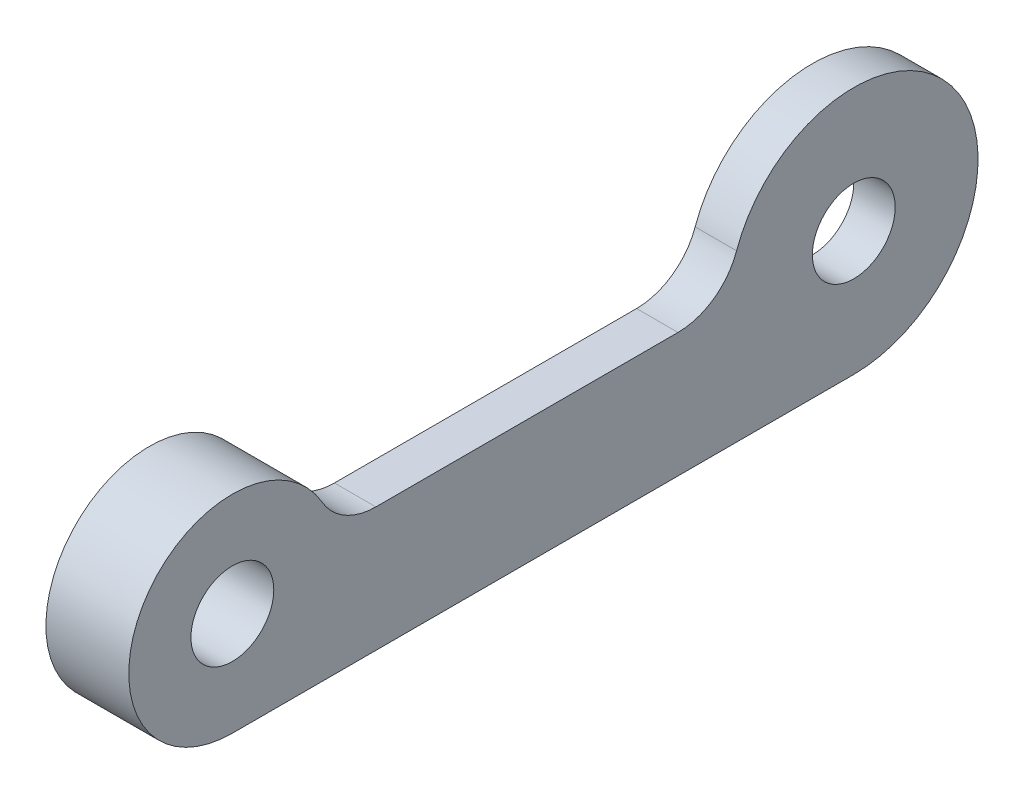
ISO-10303-21;
HEADER;
FILE_DESCRIPTION(('STEP AP214'),'2;1');
FILE_NAME('part.step','',(''),(''),'','','');
FILE_SCHEMA(('AUTOMOTIVE_DESIGN { 1 0 10303 214 1 1 1 1 }'));
ENDSEC;
DATA;
#1=APPLICATION_CONTEXT('core data for automotive mechanical design processes');
#2=APPLICATION_PROTOCOL_DEFINITION('international standard','automotive_design',2000,#1);
#3=PRODUCT_CONTEXT('',#1,'mechanical');
#4=PRODUCT('Part','Part','',(#3));
#5=PRODUCT_RELATED_PRODUCT_CATEGORY('part','',(#4));
#6=PRODUCT_DEFINITION_FORMATION('','',#4);
#7=PRODUCT_DEFINITION_CONTEXT('part definition',#1,'design');
#8=PRODUCT_DEFINITION('design','',#6,#7);
#9=PRODUCT_DEFINITION_SHAPE('','',#8);
#10=(LENGTH_UNIT() NAMED_UNIT(*) SI_UNIT(.MILLI.,.METRE.));
#11=(NAMED_UNIT(*) PLANE_ANGLE_UNIT() SI_UNIT($,.RADIAN.));
#12=(NAMED_UNIT(*) SI_UNIT($,.STERADIAN.) SOLID_ANGLE_UNIT());
#13=UNCERTAINTY_MEASURE_WITH_UNIT(LENGTH_MEASURE(1.E-05),#10,'distance_accuracy_value','');
#14=(GEOMETRIC_REPRESENTATION_CONTEXT(3) GLOBAL_UNCERTAINTY_ASSIGNED_CONTEXT((#13)) GLOBAL_UNIT_ASSIGNED_CONTEXT((#10,
#11,#12)) REPRESENTATION_CONTEXT('',''));
#15=CARTESIAN_POINT('',(0.,0.,0.));
#16=DIRECTION('',(0.,0.,1.));
#17=DIRECTION('',(1.,0.,0.));
#18=AXIS2_PLACEMENT_3D('',#15,#16,#17);
#19=CARTESIAN_POINT('',(2.,-1.,0.));
#20=DIRECTION('',(1.,0.,0.));
#21=DIRECTION('',(0.,0.,-1.));
#22=AXIS2_PLACEMENT_3D('',#19,#20,#21);
#23=PLANE('',#22);
#24=CARTESIAN_POINT('',(2.,-1.,0.));
#25=DIRECTION('',(1.,0.,0.));
#26=DIRECTION('',(0.,0.,-1.));
#27=AXIS2_PLACEMENT_3D('',#24,#25,#26);
#28=CIRCLE('',#27,2.);
#29=CARTESIAN_POINT('',(2.,-1.,-2.));
#30=VERTEX_POINT('',#29);
#31=EDGE_CURVE('E156',#30,#30,#28,.T.);
#32=ORIENTED_EDGE('',*,*,#31,.F.);
#33=EDGE_LOOP('',(#32));
#34=FACE_BOUND('',#33,.T.);
#35=CARTESIAN_POINT('',(2.,0.,-30.));
#36=DIRECTION('',(1.,0.,0.));
#37=DIRECTION('',(0.,0.,-1.));
#38=AXIS2_PLACEMENT_3D('',#35,#36,#37);
#39=CIRCLE('',#38,2.);
#40=CARTESIAN_POINT('',(2.,0.,-32.));
#41=VERTEX_POINT('',#40);
#42=EDGE_CURVE('E209',#41,#41,#39,.T.);
#43=ORIENTED_EDGE('',*,*,#42,.F.);
#44=EDGE_LOOP('',(#43));
#45=FACE_BOUND('',#44,.T.);
#46=DIRECTION('',(0.,0.,-1.));
#47=VECTOR('',#46,1.);
#48=CARTESIAN_POINT('',(2.,-6.,0.));
#49=LINE('',#48,#47);
#50=CARTESIAN_POINT('',(2.,-5.99999999999999,0.));
#51=VERTEX_POINT('',#50);
#52=CARTESIAN_POINT('',(2.,-6.,-30.));
#53=VERTEX_POINT('',#52);
#54=EDGE_CURVE('E131',#51,#53,#49,.T.);
#55=ORIENTED_EDGE('',*,*,#54,.T.);
#56=CARTESIAN_POINT('',(2.,0.,-30.));
#57=DIRECTION('',(1.,0.,0.));
#58=DIRECTION('',(0.,0.,-1.));
#59=AXIS2_PLACEMENT_3D('',#56,#57,#58);
#60=CIRCLE('',#59,6.);
#61=CARTESIAN_POINT('',(2.,2.,-24.3431457505076));
#62=VERTEX_POINT('',#61);
#63=EDGE_CURVE('E139',#53,#62,#60,.T.);
#64=ORIENTED_EDGE('',*,*,#63,.T.);
#65=CARTESIAN_POINT('',(2.,3.,-21.5147186257614));
#66=DIRECTION('',(1.,0.,0.));
#67=DIRECTION('',(0.,0.,-1.));
#68=AXIS2_PLACEMENT_3D('',#65,#66,#67);
#69=CIRCLE('',#68,3.);
#70=CARTESIAN_POINT('',(2.,0.,-21.5147186257614));
#71=VERTEX_POINT('',#70);
#72=EDGE_CURVE('E166',#62,#71,#69,.F.);
#73=ORIENTED_EDGE('',*,*,#72,.T.);
#74=DIRECTION('',(0.,0.,-1.));
#75=VECTOR('',#74,1.);
#76=CARTESIAN_POINT('',(2.,0.,0.));
#77=LINE('',#76,#75);
#78=CARTESIAN_POINT('',(2.,0.,-6.9282032302755));
#79=VERTEX_POINT('',#78);
#80=EDGE_CURVE('E146',#79,#71,#77,.T.);
#81=ORIENTED_EDGE('',*,*,#80,.F.);
#82=CARTESIAN_POINT('',(2.,3.,-6.9282032302755));
#83=DIRECTION('',(1.,0.,0.));
#84=DIRECTION('',(0.,0.,-1.));
#85=AXIS2_PLACEMENT_3D('',#82,#83,#84);
#86=CIRCLE('',#85,3.);
#87=CARTESIAN_POINT('',(2.,1.5,-4.33012701892218));
#88=VERTEX_POINT('',#87);
#89=EDGE_CURVE('E12',#79,#88,#86,.F.);
#90=ORIENTED_EDGE('',*,*,#89,.T.);
#91=CARTESIAN_POINT('',(2.,-1.,0.));
#92=DIRECTION('',(1.,0.,0.));
#93=DIRECTION('',(0.,0.,-1.));
#94=AXIS2_PLACEMENT_3D('',#91,#92,#93);
#95=CIRCLE('',#94,4.99999999999999);
#96=EDGE_CURVE('E132',#88,#51,#95,.T.);
#97=ORIENTED_EDGE('',*,*,#96,.T.);
#98=EDGE_LOOP('',(#55,#64,#73,#81,#90,#97));
#99=FACE_BOUND('',#98,.T.);
#100=ADVANCED_FACE('F65',(#34,#45,#99),#23,.T.);
#101=CARTESIAN_POINT('',(2.,-1.,0.));
#102=DIRECTION('',(-1.,0.,0.));
#103=DIRECTION('',(0.,0.,1.));
#104=AXIS2_PLACEMENT_3D('',#101,#102,#103);
#105=CYLINDRICAL_SURFACE('',#104,4.99999999999999);
#106=ORIENTED_EDGE('',*,*,#96,.F.);
#107=DIRECTION('',(-1.,0.,0.));
#108=VECTOR('',#107,1.);
#109=CARTESIAN_POINT('',(2.,1.5,-4.33012701892218));
#110=LINE('',#109,#108);
#111=CARTESIAN_POINT('',(0.,1.5,-4.33012701892218));
#112=VERTEX_POINT('',#111);
#113=EDGE_CURVE('E123',#88,#112,#110,.T.);
#114=ORIENTED_EDGE('',*,*,#113,.T.);
#115=CARTESIAN_POINT('',(0.,-1.,0.));
#116=DIRECTION('',(1.,0.,0.));
#117=DIRECTION('',(0.,0.,-1.));
#118=AXIS2_PLACEMENT_3D('',#115,#116,#117);
#119=CIRCLE('',#118,4.99999999999999);
#120=CARTESIAN_POINT('',(0.,-5.99999999999999,0.));
#121=VERTEX_POINT('',#120);
#122=EDGE_CURVE('E80',#121,#112,#119,.T.);
#123=ORIENTED_EDGE('',*,*,#122,.F.);
#124=DIRECTION('',(-1.,0.,0.));
#125=VECTOR('',#124,1.);
#126=CARTESIAN_POINT('',(2.,-6.,0.));
#127=LINE('',#126,#125);
#128=EDGE_CURVE('E120',#51,#121,#127,.T.);
#129=ORIENTED_EDGE('',*,*,#128,.F.);
#130=EDGE_LOOP('',(#106,#114,#123,#129));
#131=FACE_BOUND('',#130,.T.);
#132=CARTESIAN_POINT('',(-2.,-1.,0.));
#133=DIRECTION('',(1.,0.,0.));
#134=DIRECTION('',(0.,0.,-1.));
#135=AXIS2_PLACEMENT_3D('',#132,#133,#134);
#136=CIRCLE('',#135,4.99999999999999);
#137=CARTESIAN_POINT('',(-2.,-1.,-4.99999999999999));
#138=VERTEX_POINT('',#137);
#139=EDGE_CURVE('E152',#138,#138,#136,.T.);
#140=ORIENTED_EDGE('',*,*,#139,.T.);
#141=EDGE_LOOP('',(#140));
#142=FACE_BOUND('',#141,.T.);
#143=ADVANCED_FACE('F118',(#131,#142),#105,.T.);
#144=CARTESIAN_POINT('',(0.,-1.,0.));
#145=DIRECTION('',(1.,0.,0.));
#146=DIRECTION('',(0.,0.,-1.));
#147=AXIS2_PLACEMENT_3D('',#144,#145,#146);
#148=PLANE('',#147);
#149=CARTESIAN_POINT('',(0.,0.,-30.));
#150=DIRECTION('',(1.,0.,0.));
#151=DIRECTION('',(0.,0.,-1.));
#152=AXIS2_PLACEMENT_3D('',#149,#150,#151);
#153=CIRCLE('',#152,2.);
#154=CARTESIAN_POINT('',(0.,0.,-32.));
#155=VERTEX_POINT('',#154);
#156=EDGE_CURVE('E153',#155,#155,#153,.F.);
#157=ORIENTED_EDGE('',*,*,#156,.F.);
#158=EDGE_LOOP('',(#157));
#159=FACE_BOUND('',#158,.T.);
#160=DIRECTION('',(0.,0.,-1.));
#161=VECTOR('',#160,1.);
#162=CARTESIAN_POINT('',(0.,-6.,0.));
#163=LINE('',#162,#161);
#164=CARTESIAN_POINT('',(0.,-6.,-30.));
#165=VERTEX_POINT('',#164);
#166=EDGE_CURVE('E129',#121,#165,#163,.T.);
#167=ORIENTED_EDGE('',*,*,#166,.F.);
#168=ORIENTED_EDGE('',*,*,#122,.T.);
#169=CARTESIAN_POINT('',(0.,3.,-6.9282032302755));
#170=DIRECTION('',(1.,0.,0.));
#171=DIRECTION('',(0.,0.,-1.));
#172=AXIS2_PLACEMENT_3D('',#169,#170,#171);
#173=CIRCLE('',#172,3.);
#174=CARTESIAN_POINT('',(0.,0.,-6.9282032302755));
#175=VERTEX_POINT('',#174);
#176=EDGE_CURVE('E73',#112,#175,#173,.T.);
#177=ORIENTED_EDGE('',*,*,#176,.T.);
#178=DIRECTION('',(0.,0.,-1.));
#179=VECTOR('',#178,1.);
#180=CARTESIAN_POINT('',(0.,0.,0.));
#181=LINE('',#180,#179);
#182=CARTESIAN_POINT('',(0.,0.,-21.5147186257614));
#183=VERTEX_POINT('',#182);
#184=EDGE_CURVE('E138',#175,#183,#181,.T.);
#185=ORIENTED_EDGE('',*,*,#184,.T.);
#186=CARTESIAN_POINT('',(0.,3.,-21.5147186257614));
#187=DIRECTION('',(1.,0.,0.));
#188=DIRECTION('',(0.,0.,-1.));
#189=AXIS2_PLACEMENT_3D('',#186,#187,#188);
#190=CIRCLE('',#189,3.);
#191=CARTESIAN_POINT('',(0.,2.,-24.3431457505076));
#192=VERTEX_POINT('',#191);
#193=EDGE_CURVE('E164',#183,#192,#190,.T.);
#194=ORIENTED_EDGE('',*,*,#193,.T.);
#195=CARTESIAN_POINT('',(0.,0.,-30.));
#196=DIRECTION('',(1.,0.,0.));
#197=DIRECTION('',(0.,0.,-1.));
#198=AXIS2_PLACEMENT_3D('',#195,#196,#197);
#199=CIRCLE('',#198,6.);
#200=EDGE_CURVE('E137',#165,#192,#199,.T.);
#201=ORIENTED_EDGE('',*,*,#200,.F.);
#202=EDGE_LOOP('',(#167,#168,#177,#185,#194,#201));
#203=FACE_BOUND('',#202,.T.);
#204=ADVANCED_FACE('F135',(#159,#203),#148,.F.);
#205=CARTESIAN_POINT('',(2.,0.,-30.));
#206=DIRECTION('',(-1.,0.,0.));
#207=DIRECTION('',(0.,0.,1.));
#208=AXIS2_PLACEMENT_3D('',#205,#206,#207);
#209=CYLINDRICAL_SURFACE('',#208,6.);
#210=ORIENTED_EDGE('',*,*,#200,.T.);
#211=DIRECTION('',(-1.,0.,0.));
#212=VECTOR('',#211,1.);
#213=CARTESIAN_POINT('',(2.,2.,-24.3431457505076));
#214=LINE('',#213,#212);
#215=EDGE_CURVE('E161',#192,#62,#214,.F.);
#216=ORIENTED_EDGE('',*,*,#215,.T.);
#217=ORIENTED_EDGE('',*,*,#63,.F.);
#218=DIRECTION('',(-1.,0.,0.));
#219=VECTOR('',#218,1.);
#220=CARTESIAN_POINT('',(2.,-6.,-30.));
#221=LINE('',#220,#219);
#222=EDGE_CURVE('E149',#53,#165,#221,.T.);
#223=ORIENTED_EDGE('',*,*,#222,.T.);
#224=EDGE_LOOP('',(#210,#216,#217,#223));
#225=FACE_BOUND('',#224,.T.);
#226=ADVANCED_FACE('F187',(#225),#209,.T.);
#227=CARTESIAN_POINT('',(2.,0.,0.));
#228=DIRECTION('',(0.,1.,0.));
#229=DIRECTION('',(0.,0.,1.));
#230=AXIS2_PLACEMENT_3D('',#227,#228,#229);
#231=PLANE('',#230);
#232=ORIENTED_EDGE('',*,*,#80,.T.);
#233=DIRECTION('',(-1.,0.,0.));
#234=VECTOR('',#233,1.);
#235=CARTESIAN_POINT('',(2.,0.,-21.5147186257614));
#236=LINE('',#235,#234);
#237=EDGE_CURVE('E158',#71,#183,#236,.T.);
#238=ORIENTED_EDGE('',*,*,#237,.T.);
#239=ORIENTED_EDGE('',*,*,#184,.F.);
#240=DIRECTION('',(-1.,0.,0.));
#241=VECTOR('',#240,1.);
#242=CARTESIAN_POINT('',(2.,0.,-6.9282032302755));
#243=LINE('',#242,#241);
#244=EDGE_CURVE('E124',#175,#79,#243,.F.);
#245=ORIENTED_EDGE('',*,*,#244,.T.);
#246=EDGE_LOOP('',(#232,#238,#239,#245));
#247=FACE_BOUND('',#246,.T.);
#248=ADVANCED_FACE('F172',(#247),#231,.T.);
#249=CARTESIAN_POINT('',(2.,-6.,0.));
#250=DIRECTION('',(0.,1.,0.));
#251=DIRECTION('',(0.,0.,1.));
#252=AXIS2_PLACEMENT_3D('',#249,#250,#251);
#253=PLANE('',#252);
#254=ORIENTED_EDGE('',*,*,#166,.T.);
#255=ORIENTED_EDGE('',*,*,#222,.F.);
#256=ORIENTED_EDGE('',*,*,#54,.F.);
#257=ORIENTED_EDGE('',*,*,#128,.T.);
#258=EDGE_LOOP('',(#254,#255,#256,#257));
#259=FACE_BOUND('',#258,.T.);
#260=ADVANCED_FACE('F128',(#259),#253,.F.);
#261=CARTESIAN_POINT('',(-2.,-1.,0.));
#262=DIRECTION('',(1.,0.,0.));
#263=DIRECTION('',(0.,0.,-1.));
#264=AXIS2_PLACEMENT_3D('',#261,#262,#263);
#265=PLANE('',#264);
#266=CARTESIAN_POINT('',(-2.,-1.,0.));
#267=DIRECTION('',(1.,0.,0.));
#268=DIRECTION('',(0.,0.,-1.));
#269=AXIS2_PLACEMENT_3D('',#266,#267,#268);
#270=CIRCLE('',#269,2.);
#271=CARTESIAN_POINT('',(-2.,-1.,-2.));
#272=VERTEX_POINT('',#271);
#273=EDGE_CURVE('E212',#272,#272,#270,.T.);
#274=ORIENTED_EDGE('',*,*,#273,.T.);
#275=EDGE_LOOP('',(#274));
#276=FACE_BOUND('',#275,.T.);
#277=ORIENTED_EDGE('',*,*,#139,.F.);
#278=EDGE_LOOP('',(#277));
#279=FACE_BOUND('',#278,.T.);
#280=ADVANCED_FACE('F192',(#276,#279),#265,.F.);
#281=CARTESIAN_POINT('',(2.,-1.,0.));
#282=DIRECTION('',(-1.,0.,0.));
#283=DIRECTION('',(0.,0.,1.));
#284=AXIS2_PLACEMENT_3D('',#281,#282,#283);
#285=CYLINDRICAL_SURFACE('',#284,2.);
#286=ORIENTED_EDGE('',*,*,#31,.T.);
#287=EDGE_LOOP('',(#286));
#288=FACE_BOUND('',#287,.T.);
#289=ORIENTED_EDGE('',*,*,#273,.F.);
#290=EDGE_LOOP('',(#289));
#291=FACE_BOUND('',#290,.T.);
#292=ADVANCED_FACE('F220',(#288,#291),#285,.F.);
#293=CARTESIAN_POINT('',(2.,0.,-30.));
#294=DIRECTION('',(-1.,0.,0.));
#295=DIRECTION('',(0.,0.,1.));
#296=AXIS2_PLACEMENT_3D('',#293,#294,#295);
#297=CYLINDRICAL_SURFACE('',#296,2.);
#298=ORIENTED_EDGE('',*,*,#42,.T.);
#299=EDGE_LOOP('',(#298));
#300=FACE_BOUND('',#299,.T.);
#301=ORIENTED_EDGE('',*,*,#156,.T.);
#302=EDGE_LOOP('',(#301));
#303=FACE_BOUND('',#302,.T.);
#304=ADVANCED_FACE('F179',(#300,#303),#297,.F.);
#305=CARTESIAN_POINT('',(2.,3.,-21.5147186257614));
#306=DIRECTION('',(-1.,0.,0.));
#307=DIRECTION('',(0.,0.,1.));
#308=AXIS2_PLACEMENT_3D('',#305,#306,#307);
#309=CYLINDRICAL_SURFACE('',#308,3.);
#310=ORIENTED_EDGE('',*,*,#72,.F.);
#311=ORIENTED_EDGE('',*,*,#215,.F.);
#312=ORIENTED_EDGE('',*,*,#193,.F.);
#313=ORIENTED_EDGE('',*,*,#237,.F.);
#314=EDGE_LOOP('',(#310,#311,#312,#313));
#315=FACE_BOUND('',#314,.T.);
#316=ADVANCED_FACE('F175',(#315),#309,.F.);
#317=CARTESIAN_POINT('',(2.,3.,-6.9282032302755));
#318=DIRECTION('',(-1.,0.,0.));
#319=DIRECTION('',(0.,0.,1.));
#320=AXIS2_PLACEMENT_3D('',#317,#318,#319);
#321=CYLINDRICAL_SURFACE('',#320,3.);
#322=ORIENTED_EDGE('',*,*,#89,.F.);
#323=ORIENTED_EDGE('',*,*,#244,.F.);
#324=ORIENTED_EDGE('',*,*,#176,.F.);
#325=ORIENTED_EDGE('',*,*,#113,.F.);
#326=EDGE_LOOP('',(#322,#323,#324,#325));
#327=FACE_BOUND('',#326,.T.);
#328=ADVANCED_FACE('F67',(#327),#321,.F.);
#329=CLOSED_SHELL('',(#100,#143,#204,#226,#248,#260,#280,#292,#304,#316,#328));
#330=MANIFOLD_SOLID_BREP('B2',#329);
#331=ADVANCED_BREP_SHAPE_REPRESENTATION('',(#18,#330),#14);
#332=SHAPE_DEFINITION_REPRESENTATION(#9,#331);
ENDSEC;
END-ISO-10303-21;
